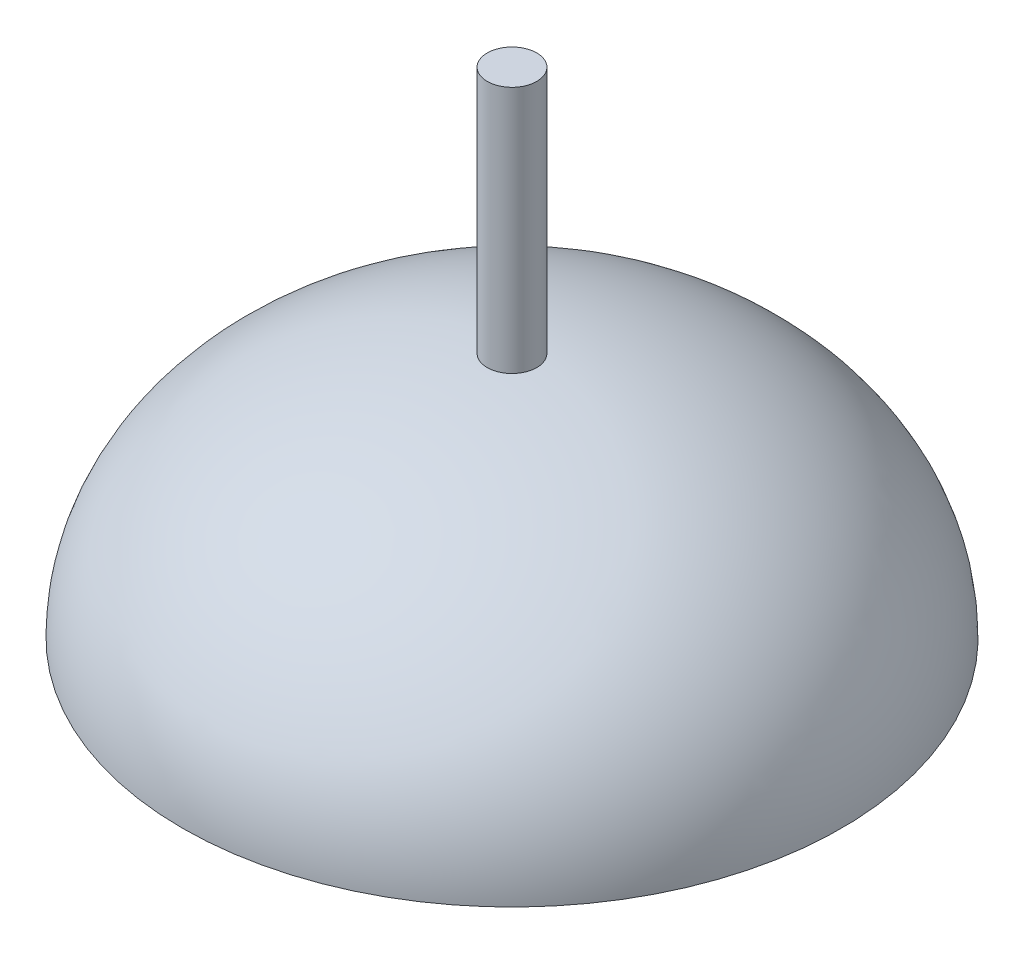
ISO-10303-21;
HEADER;
FILE_DESCRIPTION(('STEP AP214'),'2;1');
FILE_NAME('part.step','',(''),(''),'','','');
FILE_SCHEMA(('AUTOMOTIVE_DESIGN { 1 0 10303 214 1 1 1 1 }'));
ENDSEC;
DATA;
#1=APPLICATION_CONTEXT('core data for automotive mechanical design processes');
#2=APPLICATION_PROTOCOL_DEFINITION('international standard','automotive_design',2000,#1);
#3=PRODUCT_CONTEXT('',#1,'mechanical');
#4=PRODUCT('Part','Part','',(#3));
#5=PRODUCT_RELATED_PRODUCT_CATEGORY('part','',(#4));
#6=PRODUCT_DEFINITION_FORMATION('','',#4);
#7=PRODUCT_DEFINITION_CONTEXT('part definition',#1,'design');
#8=PRODUCT_DEFINITION('design','',#6,#7);
#9=PRODUCT_DEFINITION_SHAPE('','',#8);
#10=(LENGTH_UNIT() NAMED_UNIT(*) SI_UNIT(.MILLI.,.METRE.));
#11=(NAMED_UNIT(*) PLANE_ANGLE_UNIT() SI_UNIT($,.RADIAN.));
#12=(NAMED_UNIT(*) SI_UNIT($,.STERADIAN.) SOLID_ANGLE_UNIT());
#13=UNCERTAINTY_MEASURE_WITH_UNIT(LENGTH_MEASURE(1.E-05),#10,'distance_accuracy_value','');
#14=(GEOMETRIC_REPRESENTATION_CONTEXT(3) GLOBAL_UNCERTAINTY_ASSIGNED_CONTEXT((#13)) GLOBAL_UNIT_ASSIGNED_CONTEXT((#10,
#11,#12)) REPRESENTATION_CONTEXT('',''));
#15=CARTESIAN_POINT('',(0.,0.,0.));
#16=DIRECTION('',(0.,0.,1.));
#17=DIRECTION('',(1.,0.,0.));
#18=AXIS2_PLACEMENT_3D('',#15,#16,#17);
#19=CARTESIAN_POINT('',(0.,0.,0.));
#20=DIRECTION('',(0.,0.,-1.));
#21=DIRECTION('',(1.,0.,0.));
#22=AXIS2_PLACEMENT_3D('',#19,#20,#21);
#23=ELLIPSE('',#22,377.926101553641,280.99750454024);
#24=TRIMMED_CURVE('',#23,(PARAMETER_VALUE(4.71238898038469)),
(PARAMETER_VALUE(7.85398163397448)),.T.,.PARAMETER.);
#25=CARTESIAN_POINT('',(0.,300.,0.));
#26=DIRECTION('',(0.,1.,0.));
#27=AXIS1_PLACEMENT('',#25,#26);
#28=SURFACE_OF_REVOLUTION('',#24,#27);
#29=CARTESIAN_POINT('',(0.,280.110783575348,0.));
#30=DIRECTION('',(0.,1.,0.));
#31=DIRECTION('',(0.,0.,1.));
#32=AXIS2_PLACEMENT_3D('',#29,#30,#31);
#33=CIRCLE('',#32,30.);
#34=CARTESIAN_POINT('',(0.,280.110783575348,30.));
#35=VERTEX_POINT('',#34);
#36=EDGE_CURVE('E47',#35,#35,#33,.T.);
#37=ORIENTED_EDGE('',*,*,#36,.T.);
#38=EDGE_LOOP('',(#37));
#39=FACE_BOUND('',#38,.T.);
#40=CARTESIAN_POINT('',(0.,0.,0.));
#41=DIRECTION('',(0.,1.,0.));
#42=DIRECTION('',(0.,0.,1.));
#43=AXIS2_PLACEMENT_3D('',#40,#41,#42);
#44=CIRCLE('',#43,377.926101553641);
#45=CARTESIAN_POINT('',(0.,0.,377.926101553641));
#46=VERTEX_POINT('',#45);
#47=EDGE_CURVE('E10',#46,#46,#44,.T.);
#48=ORIENTED_EDGE('',*,*,#47,.F.);
#49=EDGE_LOOP('',(#48));
#50=FACE_BOUND('',#49,.T.);
#51=ADVANCED_FACE('F35',(#39,#50),#28,.T.);
#52=CARTESIAN_POINT('',(377.926101553641,0.,0.));
#53=DIRECTION('',(0.,1.,0.));
#54=DIRECTION('',(0.,0.,1.));
#55=AXIS2_PLACEMENT_3D('',#52,#53,#54);
#56=PLANE('',#55);
#57=CARTESIAN_POINT('',(0.,0.,0.));
#58=DIRECTION('',(0.,1.,0.));
#59=DIRECTION('',(0.,0.,1.));
#60=AXIS2_PLACEMENT_3D('',#57,#58,#59);
#61=CIRCLE('',#60,400.);
#62=CARTESIAN_POINT('',(0.,0.,400.));
#63=VERTEX_POINT('',#62);
#64=EDGE_CURVE('E43',#63,#63,#61,.T.);
#65=ORIENTED_EDGE('',*,*,#64,.F.);
#66=EDGE_LOOP('',(#65));
#67=FACE_BOUND('',#66,.T.);
#68=ORIENTED_EDGE('',*,*,#47,.T.);
#69=EDGE_LOOP('',(#68));
#70=FACE_BOUND('',#69,.T.);
#71=ADVANCED_FACE('F58',(#67,#70),#56,.F.);
#72=CARTESIAN_POINT('',(0.,0.,0.));
#73=DIRECTION('',(0.,0.,1.));
#74=DIRECTION('',(1.,0.,0.));
#75=AXIS2_PLACEMENT_3D('',#72,#73,#74);
#76=ELLIPSE('',#75,400.,300.);
#77=TRIMMED_CURVE('',#76,(PARAMETER_VALUE(-1.5707963267949)),(PARAMETER_VALUE(1.5707963267949)),
.T.,.PARAMETER.);
#78=CARTESIAN_POINT('',(0.,300.,0.));
#79=DIRECTION('',(0.,1.,0.));
#80=AXIS1_PLACEMENT('',#78,#79);
#81=SURFACE_OF_REVOLUTION('',#77,#80);
#82=CARTESIAN_POINT('',(0.,299.155060127687,0.));
#83=DIRECTION('',(0.,1.,0.));
#84=DIRECTION('',(0.,0.,1.));
#85=AXIS2_PLACEMENT_3D('',#82,#83,#84);
#86=CIRCLE('',#85,30.);
#87=CARTESIAN_POINT('',(0.,299.155060127687,30.));
#88=VERTEX_POINT('',#87);
#89=EDGE_CURVE('E39',#88,#88,#86,.F.);
#90=ORIENTED_EDGE('',*,*,#89,.T.);
#91=EDGE_LOOP('',(#90));
#92=FACE_BOUND('',#91,.T.);
#93=ORIENTED_EDGE('',*,*,#64,.T.);
#94=EDGE_LOOP('',(#93));
#95=FACE_BOUND('',#94,.T.);
#96=ADVANCED_FACE('F54',(#92,#95),#81,.T.);
#97=CARTESIAN_POINT('',(0.,600.,0.));
#98=DIRECTION('',(0.,1.,0.));
#99=DIRECTION('',(0.,0.,1.));
#100=AXIS2_PLACEMENT_3D('',#97,#98,#99);
#101=PLANE('',#100);
#102=CARTESIAN_POINT('',(0.,600.,0.));
#103=DIRECTION('',(0.,1.,0.));
#104=DIRECTION('',(0.,0.,1.));
#105=AXIS2_PLACEMENT_3D('',#102,#103,#104);
#106=CIRCLE('',#105,30.);
#107=CARTESIAN_POINT('',(0.,600.,30.));
#108=VERTEX_POINT('',#107);
#109=EDGE_CURVE('E77',#108,#108,#106,.T.);
#110=ORIENTED_EDGE('',*,*,#109,.T.);
#111=EDGE_LOOP('',(#110));
#112=FACE_BOUND('',#111,.T.);
#113=ADVANCED_FACE('F57',(#112),#101,.T.);
#114=CARTESIAN_POINT('',(0.,-100.,0.));
#115=DIRECTION('',(0.,1.,0.));
#116=DIRECTION('',(0.,0.,1.));
#117=AXIS2_PLACEMENT_3D('',#114,#115,#116);
#118=CYLINDRICAL_SURFACE('',#117,30.);
#119=ORIENTED_EDGE('',*,*,#109,.F.);
#120=EDGE_LOOP('',(#119));
#121=FACE_BOUND('',#120,.T.);
#122=ORIENTED_EDGE('',*,*,#89,.F.);
#123=EDGE_LOOP('',(#122));
#124=FACE_BOUND('',#123,.T.);
#125=ADVANCED_FACE('F109',(#121,#124),#118,.T.);
#126=CARTESIAN_POINT('',(0.,-100.,0.));
#127=DIRECTION('',(0.,1.,0.));
#128=DIRECTION('',(0.,0.,1.));
#129=AXIS2_PLACEMENT_3D('',#126,#127,#128);
#130=CIRCLE('',#129,30.);
#131=CARTESIAN_POINT('',(0.,-100.,30.));
#132=VERTEX_POINT('',#131);
#133=EDGE_CURVE('E79',#132,#132,#130,.T.);
#134=ORIENTED_EDGE('',*,*,#133,.T.);
#135=EDGE_LOOP('',(#134));
#136=FACE_BOUND('',#135,.T.);
#137=ORIENTED_EDGE('',*,*,#36,.F.);
#138=EDGE_LOOP('',(#137));
#139=FACE_BOUND('',#138,.T.);
#140=ADVANCED_FACE('F60',(#136,#139),#118,.T.);
#141=CARTESIAN_POINT('',(0.,-110.,0.));
#142=DIRECTION('',(0.,1.,0.));
#143=DIRECTION('',(0.,0.,1.));
#144=AXIS2_PLACEMENT_3D('',#141,#142,#143);
#145=CYLINDRICAL_SURFACE('',#144,49.1112744519882);
#146=CARTESIAN_POINT('',(0.,-110.,0.));
#147=DIRECTION('',(0.,-1.,0.));
#148=DIRECTION('',(0.,0.,-1.));
#149=AXIS2_PLACEMENT_3D('',#146,#147,#148);
#150=CIRCLE('',#149,49.1112744519882);
#151=CARTESIAN_POINT('',(0.,-110.,-49.1112744519882));
#152=VERTEX_POINT('',#151);
#153=EDGE_CURVE('E82',#152,#152,#150,.T.);
#154=ORIENTED_EDGE('',*,*,#153,.F.);
#155=EDGE_LOOP('',(#154));
#156=FACE_BOUND('',#155,.T.);
#157=CARTESIAN_POINT('',(0.,-100.,0.));
#158=DIRECTION('',(0.,-1.,0.));
#159=DIRECTION('',(0.,0.,-1.));
#160=AXIS2_PLACEMENT_3D('',#157,#158,#159);
#161=CIRCLE('',#160,49.1112744519882);
#162=CARTESIAN_POINT('',(0.,-100.,-49.1112744519882));
#163=VERTEX_POINT('',#162);
#164=EDGE_CURVE('E85',#163,#163,#161,.T.);
#165=ORIENTED_EDGE('',*,*,#164,.T.);
#166=EDGE_LOOP('',(#165));
#167=FACE_BOUND('',#166,.T.);
#168=ADVANCED_FACE('F93',(#156,#167),#145,.T.);
#169=CARTESIAN_POINT('',(0.,-110.,0.));
#170=DIRECTION('',(0.,-1.,0.));
#171=DIRECTION('',(0.,0.,-1.));
#172=AXIS2_PLACEMENT_3D('',#169,#170,#171);
#173=PLANE('',#172);
#174=ORIENTED_EDGE('',*,*,#153,.T.);
#175=EDGE_LOOP('',(#174));
#176=FACE_BOUND('',#175,.T.);
#177=ADVANCED_FACE('F91',(#176),#173,.T.);
#178=CARTESIAN_POINT('',(0.,-100.,0.));
#179=DIRECTION('',(0.,-1.,0.));
#180=DIRECTION('',(0.,0.,-1.));
#181=AXIS2_PLACEMENT_3D('',#178,#179,#180);
#182=PLANE('',#181);
#183=ORIENTED_EDGE('',*,*,#133,.F.);
#184=EDGE_LOOP('',(#183));
#185=FACE_BOUND('',#184,.T.);
#186=ORIENTED_EDGE('',*,*,#164,.F.);
#187=EDGE_LOOP('',(#186));
#188=FACE_BOUND('',#187,.T.);
#189=ADVANCED_FACE('F99',(#185,#188),#182,.F.);
#190=CLOSED_SHELL('',(#51,#71,#96,#113,#125,#140,#168,#177,#189));
#191=MANIFOLD_SOLID_BREP('B2',#190);
#192=ADVANCED_BREP_SHAPE_REPRESENTATION('',(#18,#191),#14);
#193=SHAPE_DEFINITION_REPRESENTATION(#9,#192);
ENDSEC;
END-ISO-10303-21;
